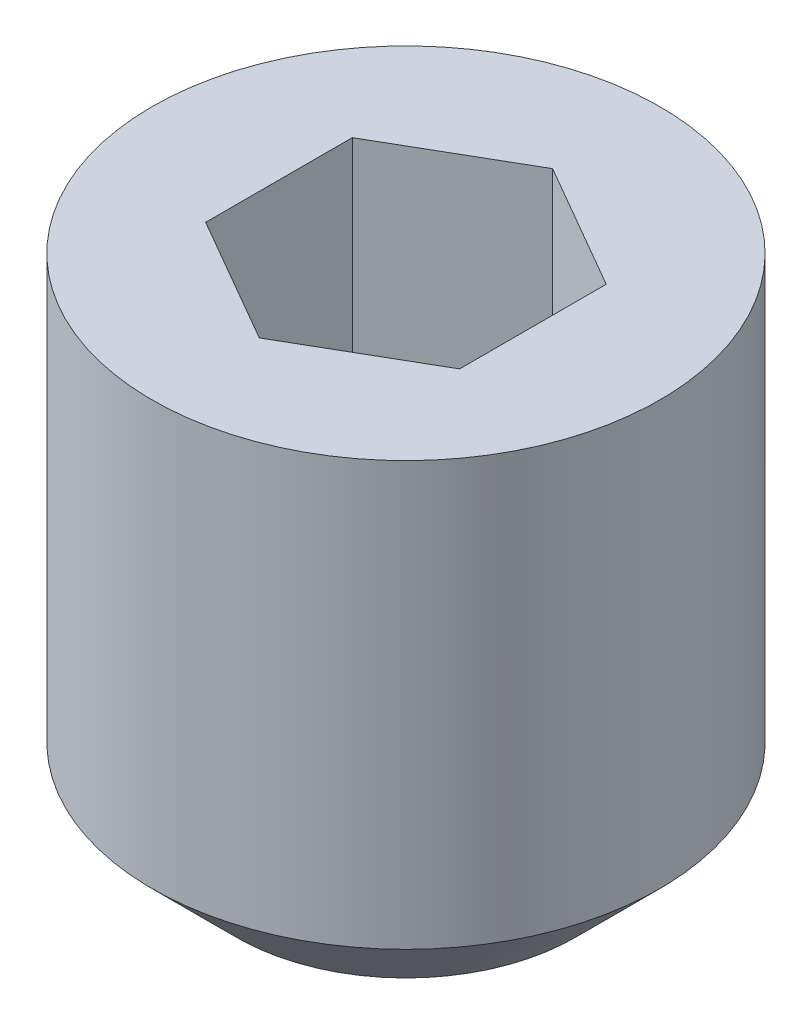
ISO-10303-21;
HEADER;
FILE_DESCRIPTION(('STEP AP214'),'2;1');
FILE_NAME('part.step','',(''),(''),'','','');
FILE_SCHEMA(('AUTOMOTIVE_DESIGN { 1 0 10303 214 1 1 1 1 }'));
ENDSEC;
DATA;
#1=APPLICATION_CONTEXT('core data for automotive mechanical design processes');
#2=APPLICATION_PROTOCOL_DEFINITION('international standard','automotive_design',2000,#1);
#3=PRODUCT_CONTEXT('',#1,'mechanical');
#4=PRODUCT('Part','Part','',(#3));
#5=PRODUCT_RELATED_PRODUCT_CATEGORY('part','',(#4));
#6=PRODUCT_DEFINITION_FORMATION('','',#4);
#7=PRODUCT_DEFINITION_CONTEXT('part definition',#1,'design');
#8=PRODUCT_DEFINITION('design','',#6,#7);
#9=PRODUCT_DEFINITION_SHAPE('','',#8);
#10=(LENGTH_UNIT() NAMED_UNIT(*) SI_UNIT(.MILLI.,.METRE.));
#11=(NAMED_UNIT(*) PLANE_ANGLE_UNIT() SI_UNIT($,.RADIAN.));
#12=(NAMED_UNIT(*) SI_UNIT($,.STERADIAN.) SOLID_ANGLE_UNIT());
#13=UNCERTAINTY_MEASURE_WITH_UNIT(LENGTH_MEASURE(1.E-05),#10,'distance_accuracy_value','');
#14=(GEOMETRIC_REPRESENTATION_CONTEXT(3) GLOBAL_UNCERTAINTY_ASSIGNED_CONTEXT((#13)) GLOBAL_UNIT_ASSIGNED_CONTEXT((#10,
#11,#12)) REPRESENTATION_CONTEXT('',''));
#15=CARTESIAN_POINT('',(0.,0.,0.));
#16=DIRECTION('',(0.,0.,1.));
#17=DIRECTION('',(1.,0.,0.));
#18=AXIS2_PLACEMENT_3D('',#15,#16,#17);
#19=CARTESIAN_POINT('',(0.,3.,0.));
#20=DIRECTION('',(0.,-1.,0.));
#21=DIRECTION('',(1.,0.,0.));
#22=AXIS2_PLACEMENT_3D('',#19,#20,#21);
#23=PLANE('',#22);
#24=CARTESIAN_POINT('',(0.,3.,0.));
#25=DIRECTION('',(0.,1.,0.));
#26=DIRECTION('',(-1.,0.,0.));
#27=AXIS2_PLACEMENT_3D('',#24,#25,#26);
#28=CIRCLE('',#27,1.5);
#29=CARTESIAN_POINT('',(-1.5,3.,0.));
#30=VERTEX_POINT('',#29);
#31=EDGE_CURVE('E11',#30,#30,#28,.T.);
#32=ORIENTED_EDGE('',*,*,#31,.T.);
#33=EDGE_LOOP('',(#32));
#34=FACE_BOUND('',#33,.T.);
#35=DIRECTION('',(-0.866025403784438,0.,0.5));
#36=VECTOR('',#35,1.);
#37=CARTESIAN_POINT('',(0.,3.,-0.866025403784438));
#38=LINE('',#37,#36);
#39=CARTESIAN_POINT('',(0.,3.,-0.866025403784439));
#40=VERTEX_POINT('',#39);
#41=CARTESIAN_POINT('',(-0.75,3.,-0.433012701892219));
#42=VERTEX_POINT('',#41);
#43=EDGE_CURVE('E150',#40,#42,#38,.T.);
#44=ORIENTED_EDGE('',*,*,#43,.F.);
#45=DIRECTION('',(-0.866025403784439,0.,-0.499999999999999));
#46=VECTOR('',#45,1.);
#47=CARTESIAN_POINT('',(0.75,3.,-0.43301270189222));
#48=LINE('',#47,#46);
#49=CARTESIAN_POINT('',(0.75,3.,-0.43301270189222));
#50=VERTEX_POINT('',#49);
#51=EDGE_CURVE('E50',#50,#40,#48,.T.);
#52=ORIENTED_EDGE('',*,*,#51,.F.);
#53=DIRECTION('',(0.,0.,-1.));
#54=VECTOR('',#53,1.);
#55=CARTESIAN_POINT('',(0.75,3.,0.433012701892219));
#56=LINE('',#55,#54);
#57=CARTESIAN_POINT('',(0.75,3.,0.433012701892219));
#58=VERTEX_POINT('',#57);
#59=EDGE_CURVE('E120',#58,#50,#56,.T.);
#60=ORIENTED_EDGE('',*,*,#59,.F.);
#61=DIRECTION('',(0.866025403784438,0.,-0.5));
#62=VECTOR('',#61,1.);
#63=CARTESIAN_POINT('',(0.,3.,0.866025403784438));
#64=LINE('',#63,#62);
#65=CARTESIAN_POINT('',(0.,3.,0.866025403784438));
#66=VERTEX_POINT('',#65);
#67=EDGE_CURVE('E158',#66,#58,#64,.T.);
#68=ORIENTED_EDGE('',*,*,#67,.F.);
#69=DIRECTION('',(0.866025403784439,0.,0.5));
#70=VECTOR('',#69,1.);
#71=CARTESIAN_POINT('',(-0.75,3.,0.433012701892219));
#72=LINE('',#71,#70);
#73=CARTESIAN_POINT('',(-0.75,3.,0.433012701892219));
#74=VERTEX_POINT('',#73);
#75=EDGE_CURVE('E155',#74,#66,#72,.T.);
#76=ORIENTED_EDGE('',*,*,#75,.F.);
#77=DIRECTION('',(0.,0.,1.));
#78=VECTOR('',#77,1.);
#79=CARTESIAN_POINT('',(-0.75,3.,-0.433012701892219));
#80=LINE('',#79,#78);
#81=EDGE_CURVE('E153',#42,#74,#80,.T.);
#82=ORIENTED_EDGE('',*,*,#81,.F.);
#83=EDGE_LOOP('',(#44,#52,#60,#68,#76,#82));
#84=FACE_BOUND('',#83,.T.);
#85=ADVANCED_FACE('F36',(#34,#84),#23,.F.);
#86=CARTESIAN_POINT('',(0.,3.,0.));
#87=DIRECTION('',(0.,1.,0.));
#88=DIRECTION('',(-1.,0.,0.));
#89=AXIS2_PLACEMENT_3D('',#86,#87,#88);
#90=CYLINDRICAL_SURFACE('',#89,1.5);
#91=CARTESIAN_POINT('',(0.,0.499999999999995,0.));
#92=DIRECTION('',(0.,-1.,0.));
#93=DIRECTION('',(0.,0.,-1.));
#94=AXIS2_PLACEMENT_3D('',#91,#92,#93);
#95=CIRCLE('',#94,1.5);
#96=CARTESIAN_POINT('',(0.,0.499999999999995,-1.5));
#97=VERTEX_POINT('',#96);
#98=EDGE_CURVE('E359',#97,#97,#95,.T.);
#99=ORIENTED_EDGE('',*,*,#98,.F.);
#100=EDGE_LOOP('',(#99));
#101=FACE_BOUND('',#100,.T.);
#102=ORIENTED_EDGE('',*,*,#31,.F.);
#103=EDGE_LOOP('',(#102));
#104=FACE_BOUND('',#103,.T.);
#105=ADVANCED_FACE('F219',(#101,#104),#90,.T.);
#106=CARTESIAN_POINT('',(0.75,1.8,-0.43301270189222));
#107=DIRECTION('',(0.499999999999999,0.,-0.866025403784439));
#108=DIRECTION('',(-0.866025403784439,0.,-0.499999999999999));
#109=AXIS2_PLACEMENT_3D('',#106,#107,#108);
#110=PLANE('',#109);
#111=DIRECTION('',(-0.866025403784439,0.,-0.499999999999999));
#112=VECTOR('',#111,1.);
#113=CARTESIAN_POINT('',(0.75,1.8,-0.43301270189222));
#114=LINE('',#113,#112);
#115=CARTESIAN_POINT('',(0.75,1.8,-0.43301270189222));
#116=VERTEX_POINT('',#115);
#117=CARTESIAN_POINT('',(0.375,1.8,-0.649519052838329));
#118=VERTEX_POINT('',#117);
#119=EDGE_CURVE('E119',#116,#118,#114,.T.);
#120=ORIENTED_EDGE('',*,*,#119,.F.);
#121=DIRECTION('',(0.,1.,0.));
#122=VECTOR('',#121,1.);
#123=CARTESIAN_POINT('',(0.75,1.8,-0.43301270189222));
#124=LINE('',#123,#122);
#125=EDGE_CURVE('E161',#116,#50,#124,.T.);
#126=ORIENTED_EDGE('',*,*,#125,.T.);
#127=ORIENTED_EDGE('',*,*,#51,.T.);
#128=DIRECTION('',(0.,1.,0.));
#129=VECTOR('',#128,1.);
#130=CARTESIAN_POINT('',(0.,1.8,-0.866025403784438));
#131=LINE('',#130,#129);
#132=CARTESIAN_POINT('',(0.,1.8,-0.866025403784438));
#133=VERTEX_POINT('',#132);
#134=EDGE_CURVE('E122',#133,#40,#131,.T.);
#135=ORIENTED_EDGE('',*,*,#134,.F.);
#136=EDGE_CURVE('E111',#118,#133,#114,.T.);
#137=ORIENTED_EDGE('',*,*,#136,.F.);
#138=EDGE_LOOP('',(#120,#126,#127,#135,#137));
#139=FACE_BOUND('',#138,.T.);
#140=ADVANCED_FACE('F123',(#139),#110,.F.);
#141=CARTESIAN_POINT('',(0.75,1.8,0.433012701892219));
#142=DIRECTION('',(1.,0.,0.));
#143=DIRECTION('',(0.,0.,-1.));
#144=AXIS2_PLACEMENT_3D('',#141,#142,#143);
#145=PLANE('',#144);
#146=DIRECTION('',(0.,0.,-1.));
#147=VECTOR('',#146,1.);
#148=CARTESIAN_POINT('',(0.75,1.8,0.433012701892219));
#149=LINE('',#148,#147);
#150=CARTESIAN_POINT('',(0.75,1.8,0.433012701892219));
#151=VERTEX_POINT('',#150);
#152=CARTESIAN_POINT('',(0.75,1.8,0.));
#153=VERTEX_POINT('',#152);
#154=EDGE_CURVE('E127',#151,#153,#149,.T.);
#155=ORIENTED_EDGE('',*,*,#154,.F.);
#156=DIRECTION('',(0.,1.,0.));
#157=VECTOR('',#156,1.);
#158=CARTESIAN_POINT('',(0.75,1.8,0.433012701892219));
#159=LINE('',#158,#157);
#160=EDGE_CURVE('E164',#151,#58,#159,.T.);
#161=ORIENTED_EDGE('',*,*,#160,.T.);
#162=ORIENTED_EDGE('',*,*,#59,.T.);
#163=ORIENTED_EDGE('',*,*,#125,.F.);
#164=EDGE_CURVE('E146',#153,#116,#149,.T.);
#165=ORIENTED_EDGE('',*,*,#164,.F.);
#166=EDGE_LOOP('',(#155,#161,#162,#163,#165));
#167=FACE_BOUND('',#166,.T.);
#168=ADVANCED_FACE('F192',(#167),#145,.F.);
#169=CARTESIAN_POINT('',(0.,1.8,0.866025403784438));
#170=DIRECTION('',(0.5,0.,0.866025403784438));
#171=DIRECTION('',(0.866025403784438,0.,-0.5));
#172=AXIS2_PLACEMENT_3D('',#169,#170,#171);
#173=PLANE('',#172);
#174=DIRECTION('',(0.866025403784438,0.,-0.5));
#175=VECTOR('',#174,1.);
#176=CARTESIAN_POINT('',(0.,1.8,0.866025403784438));
#177=LINE('',#176,#175);
#178=CARTESIAN_POINT('',(0.,1.8,0.866025403784438));
#179=VERTEX_POINT('',#178);
#180=CARTESIAN_POINT('',(0.375,1.8,0.649519052838329));
#181=VERTEX_POINT('',#180);
#182=EDGE_CURVE('E58',#179,#181,#177,.T.);
#183=ORIENTED_EDGE('',*,*,#182,.F.);
#184=DIRECTION('',(0.,1.,0.));
#185=VECTOR('',#184,1.);
#186=CARTESIAN_POINT('',(0.,1.8,0.866025403784438));
#187=LINE('',#186,#185);
#188=EDGE_CURVE('E167',#179,#66,#187,.T.);
#189=ORIENTED_EDGE('',*,*,#188,.T.);
#190=ORIENTED_EDGE('',*,*,#67,.T.);
#191=ORIENTED_EDGE('',*,*,#160,.F.);
#192=EDGE_CURVE('E144',#181,#151,#177,.T.);
#193=ORIENTED_EDGE('',*,*,#192,.F.);
#194=EDGE_LOOP('',(#183,#189,#190,#191,#193));
#195=FACE_BOUND('',#194,.T.);
#196=ADVANCED_FACE('F247',(#195),#173,.F.);
#197=CARTESIAN_POINT('',(-0.75,1.8,0.433012701892219));
#198=DIRECTION('',(-0.5,0.,0.866025403784439));
#199=DIRECTION('',(0.866025403784439,0.,0.5));
#200=AXIS2_PLACEMENT_3D('',#197,#198,#199);
#201=PLANE('',#200);
#202=DIRECTION('',(0.866025403784439,0.,0.5));
#203=VECTOR('',#202,1.);
#204=CARTESIAN_POINT('',(-0.75,1.8,0.433012701892219));
#205=LINE('',#204,#203);
#206=CARTESIAN_POINT('',(-0.75,1.8,0.433012701892219));
#207=VERTEX_POINT('',#206);
#208=CARTESIAN_POINT('',(-0.374999999999999,1.8,0.649519052838329));
#209=VERTEX_POINT('',#208);
#210=EDGE_CURVE('E141',#207,#209,#205,.T.);
#211=ORIENTED_EDGE('',*,*,#210,.F.);
#212=DIRECTION('',(0.,1.,0.));
#213=VECTOR('',#212,1.);
#214=CARTESIAN_POINT('',(-0.75,1.8,0.433012701892219));
#215=LINE('',#214,#213);
#216=EDGE_CURVE('E170',#207,#74,#215,.T.);
#217=ORIENTED_EDGE('',*,*,#216,.T.);
#218=ORIENTED_EDGE('',*,*,#75,.T.);
#219=ORIENTED_EDGE('',*,*,#188,.F.);
#220=EDGE_CURVE('E140',#209,#179,#205,.T.);
#221=ORIENTED_EDGE('',*,*,#220,.F.);
#222=EDGE_LOOP('',(#211,#217,#218,#219,#221));
#223=FACE_BOUND('',#222,.T.);
#224=ADVANCED_FACE('F244',(#223),#201,.F.);
#225=CARTESIAN_POINT('',(-0.75,1.8,-0.433012701892219));
#226=DIRECTION('',(-1.,0.,0.));
#227=DIRECTION('',(0.,0.,1.));
#228=AXIS2_PLACEMENT_3D('',#225,#226,#227);
#229=PLANE('',#228);
#230=DIRECTION('',(0.,0.,1.));
#231=VECTOR('',#230,1.);
#232=CARTESIAN_POINT('',(-0.75,1.8,-0.433012701892219));
#233=LINE('',#232,#231);
#234=CARTESIAN_POINT('',(-0.75,1.8,-0.433012701892219));
#235=VERTEX_POINT('',#234);
#236=CARTESIAN_POINT('',(-0.75,1.8,0.));
#237=VERTEX_POINT('',#236);
#238=EDGE_CURVE('E135',#235,#237,#233,.T.);
#239=ORIENTED_EDGE('',*,*,#238,.F.);
#240=DIRECTION('',(0.,1.,0.));
#241=VECTOR('',#240,1.);
#242=CARTESIAN_POINT('',(-0.75,1.8,-0.433012701892219));
#243=LINE('',#242,#241);
#244=EDGE_CURVE('E126',#235,#42,#243,.T.);
#245=ORIENTED_EDGE('',*,*,#244,.T.);
#246=ORIENTED_EDGE('',*,*,#81,.T.);
#247=ORIENTED_EDGE('',*,*,#216,.F.);
#248=EDGE_CURVE('E133',#237,#207,#233,.T.);
#249=ORIENTED_EDGE('',*,*,#248,.F.);
#250=EDGE_LOOP('',(#239,#245,#246,#247,#249));
#251=FACE_BOUND('',#250,.T.);
#252=ADVANCED_FACE('F202',(#251),#229,.F.);
#253=CARTESIAN_POINT('',(0.,1.8,-0.866025403784438));
#254=DIRECTION('',(-0.5,0.,-0.866025403784438));
#255=DIRECTION('',(-0.866025403784439,0.,0.5));
#256=AXIS2_PLACEMENT_3D('',#253,#254,#255);
#257=PLANE('',#256);
#258=DIRECTION('',(-0.866025403784438,0.,0.5));
#259=VECTOR('',#258,1.);
#260=CARTESIAN_POINT('',(0.,1.8,-0.866025403784438));
#261=LINE('',#260,#259);
#262=CARTESIAN_POINT('',(-0.375,1.8,-0.649519052838329));
#263=VERTEX_POINT('',#262);
#264=EDGE_CURVE('E114',#133,#263,#261,.T.);
#265=ORIENTED_EDGE('',*,*,#264,.F.);
#266=ORIENTED_EDGE('',*,*,#134,.T.);
#267=ORIENTED_EDGE('',*,*,#43,.T.);
#268=ORIENTED_EDGE('',*,*,#244,.F.);
#269=EDGE_CURVE('E132',#263,#235,#261,.T.);
#270=ORIENTED_EDGE('',*,*,#269,.F.);
#271=EDGE_LOOP('',(#265,#266,#267,#268,#270));
#272=FACE_BOUND('',#271,.T.);
#273=ADVANCED_FACE('F130',(#272),#257,.F.);
#274=CARTESIAN_POINT('',(0.,1.8,0.));
#275=DIRECTION('',(0.,1.,0.));
#276=DIRECTION('',(0.,0.,1.));
#277=AXIS2_PLACEMENT_3D('',#274,#275,#276);
#278=PLANE('',#277);
#279=ORIENTED_EDGE('',*,*,#192,.T.);
#280=ORIENTED_EDGE('',*,*,#154,.T.);
#281=CARTESIAN_POINT('',(0.,1.8,0.));
#282=DIRECTION('',(0.,1.,0.));
#283=DIRECTION('',(-1.,0.,0.));
#284=AXIS2_PLACEMENT_3D('',#281,#282,#283);
#285=CIRCLE('',#284,0.75);
#286=EDGE_CURVE('E179',#181,#153,#285,.T.);
#287=ORIENTED_EDGE('',*,*,#286,.F.);
#288=EDGE_LOOP('',(#279,#280,#287));
#289=FACE_BOUND('',#288,.T.);
#290=ADVANCED_FACE('F187',(#289),#278,.T.);
#291=ORIENTED_EDGE('',*,*,#164,.T.);
#292=ORIENTED_EDGE('',*,*,#119,.T.);
#293=EDGE_CURVE('E180',#153,#118,#285,.T.);
#294=ORIENTED_EDGE('',*,*,#293,.F.);
#295=EDGE_LOOP('',(#291,#292,#294));
#296=FACE_BOUND('',#295,.T.);
#297=ADVANCED_FACE('F196',(#296),#278,.T.);
#298=ORIENTED_EDGE('',*,*,#136,.T.);
#299=ORIENTED_EDGE('',*,*,#264,.T.);
#300=EDGE_CURVE('E116',#118,#263,#285,.T.);
#301=ORIENTED_EDGE('',*,*,#300,.F.);
#302=EDGE_LOOP('',(#298,#299,#301));
#303=FACE_BOUND('',#302,.T.);
#304=ADVANCED_FACE('F112',(#303),#278,.T.);
#305=ORIENTED_EDGE('',*,*,#269,.T.);
#306=ORIENTED_EDGE('',*,*,#238,.T.);
#307=EDGE_CURVE('E163',#263,#237,#285,.T.);
#308=ORIENTED_EDGE('',*,*,#307,.F.);
#309=EDGE_LOOP('',(#305,#306,#308));
#310=FACE_BOUND('',#309,.T.);
#311=ADVANCED_FACE('F206',(#310),#278,.T.);
#312=ORIENTED_EDGE('',*,*,#248,.T.);
#313=ORIENTED_EDGE('',*,*,#210,.T.);
#314=EDGE_CURVE('E43',#237,#209,#285,.T.);
#315=ORIENTED_EDGE('',*,*,#314,.F.);
#316=EDGE_LOOP('',(#312,#313,#315));
#317=FACE_BOUND('',#316,.T.);
#318=ADVANCED_FACE('F208',(#317),#278,.T.);
#319=ORIENTED_EDGE('',*,*,#220,.T.);
#320=ORIENTED_EDGE('',*,*,#182,.T.);
#321=EDGE_CURVE('E175',#209,#181,#285,.T.);
#322=ORIENTED_EDGE('',*,*,#321,.F.);
#323=EDGE_LOOP('',(#319,#320,#322));
#324=FACE_BOUND('',#323,.T.);
#325=ADVANCED_FACE('F214',(#324),#278,.T.);
#326=CARTESIAN_POINT('',(0.,1.36698729810778,0.));
#327=DIRECTION('',(0.,1.,0.));
#328=DIRECTION('',(-1.,0.,0.));
#329=AXIS2_PLACEMENT_3D('',#326,#327,#328);
#330=CONICAL_SURFACE('',#329,0.,1.0471975511966);
#331=ORIENTED_EDGE('',*,*,#314,.T.);
#332=ORIENTED_EDGE('',*,*,#321,.T.);
#333=ORIENTED_EDGE('',*,*,#286,.T.);
#334=ORIENTED_EDGE('',*,*,#293,.T.);
#335=ORIENTED_EDGE('',*,*,#300,.T.);
#336=ORIENTED_EDGE('',*,*,#307,.T.);
#337=EDGE_LOOP('',(#331,#332,#333,#334,#335,#336));
#338=FACE_BOUND('',#337,.T.);
#339=CARTESIAN_POINT('',(0.,1.36698729810778,0.));
#340=VERTEX_POINT('',#339);
#341=VERTEX_LOOP('',#340);
#342=FACE_BOUND('',#341,.T.);
#343=ADVANCED_FACE('F184',(#338,#342),#330,.F.);
#344=CARTESIAN_POINT('',(0.,0.499999999999995,0.));
#345=DIRECTION('',(0.,1.,0.));
#346=DIRECTION('',(0.,0.,1.));
#347=AXIS2_PLACEMENT_3D('',#344,#345,#346);
#348=CONICAL_SURFACE('',#347,1.5,0.785398163397453);
#349=CARTESIAN_POINT('',(0.,0.,0.));
#350=DIRECTION('',(0.,-1.,0.));
#351=DIRECTION('',(0.,0.,-1.));
#352=AXIS2_PLACEMENT_3D('',#349,#350,#351);
#353=CIRCLE('',#352,1.);
#354=CARTESIAN_POINT('',(0.,0.,-1.));
#355=VERTEX_POINT('',#354);
#356=EDGE_CURVE('E151',#355,#355,#353,.T.);
#357=ORIENTED_EDGE('',*,*,#356,.F.);
#358=EDGE_LOOP('',(#357));
#359=FACE_BOUND('',#358,.T.);
#360=ORIENTED_EDGE('',*,*,#98,.T.);
#361=EDGE_LOOP('',(#360));
#362=FACE_BOUND('',#361,.T.);
#363=ADVANCED_FACE('F236',(#359,#362),#348,.T.);
#364=CARTESIAN_POINT('',(1.5,0.,0.));
#365=DIRECTION('',(0.,1.,0.));
#366=DIRECTION('',(-1.,0.,0.));
#367=AXIS2_PLACEMENT_3D('',#364,#365,#366);
#368=PLANE('',#367);
#369=ORIENTED_EDGE('',*,*,#356,.T.);
#370=EDGE_LOOP('',(#369));
#371=FACE_BOUND('',#370,.T.);
#372=ADVANCED_FACE('F233',(#371),#368,.F.);
#373=CLOSED_SHELL('',(#85,#105,#140,#168,#196,#224,#252,#273,#290,#297,#304,#311,#318,#325,#343,
#363,#372));
#374=MANIFOLD_SOLID_BREP('B2',#373);
#375=ADVANCED_BREP_SHAPE_REPRESENTATION('',(#18,#374),#14);
#376=SHAPE_DEFINITION_REPRESENTATION(#9,#375);
ENDSEC;
END-ISO-10303-21;
